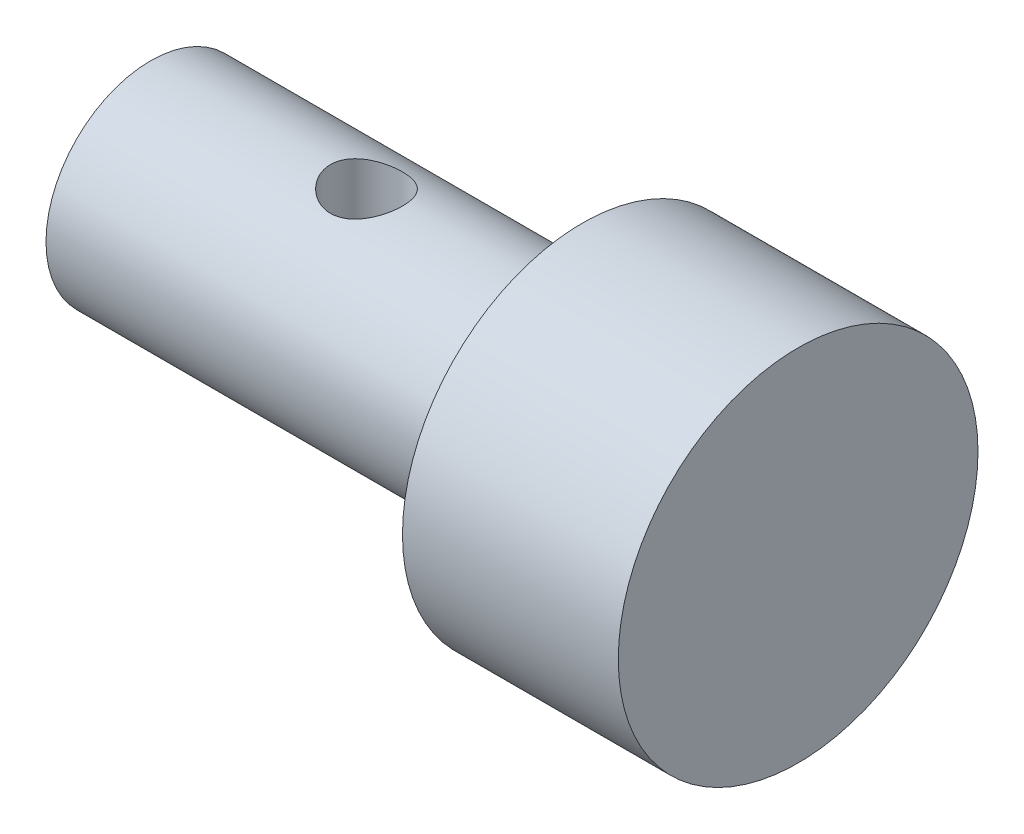
ISO-10303-21;
HEADER;
FILE_DESCRIPTION(('STEP AP214'),'2;1');
FILE_NAME('part.step','',(''),(''),'','','');
FILE_SCHEMA(('AUTOMOTIVE_DESIGN { 1 0 10303 214 1 1 1 1 }'));
ENDSEC;
DATA;
#1=APPLICATION_CONTEXT('core data for automotive mechanical design processes');
#2=APPLICATION_PROTOCOL_DEFINITION('international standard','automotive_design',2000,#1);
#3=PRODUCT_CONTEXT('',#1,'mechanical');
#4=PRODUCT('Part','Part','',(#3));
#5=PRODUCT_RELATED_PRODUCT_CATEGORY('part','',(#4));
#6=PRODUCT_DEFINITION_FORMATION('','',#4);
#7=PRODUCT_DEFINITION_CONTEXT('part definition',#1,'design');
#8=PRODUCT_DEFINITION('design','',#6,#7);
#9=PRODUCT_DEFINITION_SHAPE('','',#8);
#10=(LENGTH_UNIT() NAMED_UNIT(*) SI_UNIT(.MILLI.,.METRE.));
#11=(NAMED_UNIT(*) PLANE_ANGLE_UNIT() SI_UNIT($,.RADIAN.));
#12=(NAMED_UNIT(*) SI_UNIT($,.STERADIAN.) SOLID_ANGLE_UNIT());
#13=UNCERTAINTY_MEASURE_WITH_UNIT(LENGTH_MEASURE(1.E-05),#10,'distance_accuracy_value','');
#14=(GEOMETRIC_REPRESENTATION_CONTEXT(3) GLOBAL_UNCERTAINTY_ASSIGNED_CONTEXT((#13)) GLOBAL_UNIT_ASSIGNED_CONTEXT((#10,
#11,#12)) REPRESENTATION_CONTEXT('',''));
#15=CARTESIAN_POINT('',(0.,0.,0.));
#16=DIRECTION('',(0.,0.,1.));
#17=DIRECTION('',(1.,0.,0.));
#18=AXIS2_PLACEMENT_3D('',#15,#16,#17);
#19=CARTESIAN_POINT('',(6.,0.,0.));
#20=DIRECTION('',(-1.,0.,0.));
#21=DIRECTION('',(0.,0.,1.));
#22=AXIS2_PLACEMENT_3D('',#19,#20,#21);
#23=CYLINDRICAL_SURFACE('',#22,1.455);
#24=CARTESIAN_POINT('',(3.,-1.36639123240747,0.500000000000001));
#25=CARTESIAN_POINT('',(3.02717955991746,-1.36639097811817,0.500000312731613));
#26=CARTESIAN_POINT('',(3.05435695805042,-1.3672110489003,0.497776345713997));
#27=CARTESIAN_POINT('',(3.10790316012988,-1.37038431023373,0.488971673841802));
#28=CARTESIAN_POINT('',(3.13427187170271,-1.37273767525038,0.482390473199555));
#29=CARTESIAN_POINT('',(3.18541562417104,-1.37868015875037,0.465132564264616));
#30=CARTESIAN_POINT('',(3.21019382677888,-1.38226672943625,0.454464294689386));
#31=CARTESIAN_POINT('',(3.25761726235279,-1.39026770944465,0.42936418702639));
#32=CARTESIAN_POINT('',(3.28026197809996,-1.39468231873585,0.414931439499747));
#33=CARTESIAN_POINT('',(3.32371799419318,-1.40404795409862,0.382068692414853));
#34=CARTESIAN_POINT('',(3.34442764982769,-1.40901294814996,0.363508230347457));
#35=CARTESIAN_POINT('',(3.38251026359022,-1.41880223847988,0.323194958876108));
#36=CARTESIAN_POINT('',(3.39988264712127,-1.42362651040849,0.301441600868594));
#37=CARTESIAN_POINT('',(3.43126543844549,-1.43275353066899,0.25461005240966));
#38=CARTESIAN_POINT('',(3.44516840090946,-1.43703795070782,0.229455972061945));
#39=CARTESIAN_POINT('',(3.46850489200208,-1.44443717268994,0.176993427231699));
#40=CARTESIAN_POINT('',(3.47793970594978,-1.44755231093828,0.149685584945858));
#41=CARTESIAN_POINT('',(3.49172461408698,-1.45216299283854,0.0947571154949555));
#42=CARTESIAN_POINT('',(3.49624903833515,-1.45371391556177,0.0671849745644268));
#43=CARTESIAN_POINT('',(3.5006400547362,-1.45521851130384,0.0116321325668065));
#44=CARTESIAN_POINT('',(3.50050792121369,-1.45517262131027,-0.016348454628745));
#45=CARTESIAN_POINT('',(3.49569800888364,-1.45352574816606,-0.0706863211139652));
#46=CARTESIAN_POINT('',(3.49120979033516,-1.45198961593433,-0.0970626718601401));
#47=CARTESIAN_POINT('',(3.47812986112621,-1.44761714360993,-0.148662052440881));
#48=CARTESIAN_POINT('',(3.46953786826021,-1.44478071409985,-0.173885002828482));
#49=CARTESIAN_POINT('',(3.44838916471048,-1.43804602880742,-0.222864410317829));
#50=CARTESIAN_POINT('',(3.43578032109064,-1.43413390908427,-0.246596372051854));
#51=CARTESIAN_POINT('',(3.40699947712573,-1.42565240959854,-0.291662127171063));
#52=CARTESIAN_POINT('',(3.39082644364859,-1.42108283939799,-0.312995222496682));
#53=CARTESIAN_POINT('',(3.35443075951494,-1.41149683623094,-0.353783192591456));
#54=CARTESIAN_POINT('',(3.3340464503007,-1.40646948255308,-0.373091465112166));
#55=CARTESIAN_POINT('',(3.29028903101524,-1.39672419493074,-0.408064861632907));
#56=CARTESIAN_POINT('',(3.26691539920394,-1.39200631521816,-0.423729348317868));
#57=CARTESIAN_POINT('',(3.21735167832106,-1.38335212869181,-0.451190983426911));
#58=CARTESIAN_POINT('',(3.19112253336528,-1.37942952410187,-0.462922294548846));
#59=CARTESIAN_POINT('',(3.13689188192548,-1.37296824111035,-0.481750423449409));
#60=CARTESIAN_POINT('',(3.10889118086031,-1.37042893878043,-0.488849330926126));
#61=CARTESIAN_POINT('',(3.0533397472715,-1.36716435499601,-0.497904436508698));
#62=CARTESIAN_POINT('',(3.02583103246436,-1.36635848431615,-0.500089329754137));
#63=CARTESIAN_POINT('',(2.97083407681782,-1.36642601678656,-0.499905109547407));
#64=CARTESIAN_POINT('',(2.94334583301648,-1.3672990898199,-0.497536891336228));
#65=CARTESIAN_POINT('',(2.89024061650609,-1.37054542078883,-0.488519667509383));
#66=CARTESIAN_POINT('',(2.86459209045521,-1.37286149883476,-0.48203365376347));
#67=CARTESIAN_POINT('',(2.81475396729411,-1.37866879378836,-0.465162761685819));
#68=CARTESIAN_POINT('',(2.79056463982358,-1.38216022710582,-0.454777165311102));
#69=CARTESIAN_POINT('',(2.74344098095493,-1.39006814276105,-0.43001094582003));
#70=CARTESIAN_POINT('',(2.7205749644379,-1.39451148507407,-0.415509150754988));
#71=CARTESIAN_POINT('',(2.6775185702225,-1.40377216610918,-0.383057444619011));
#72=CARTESIAN_POINT('',(2.65732903173399,-1.40858962138712,-0.365106456354439));
#73=CARTESIAN_POINT('',(2.61912000582259,-1.4183566247392,-0.325165888852871));
#74=CARTESIAN_POINT('',(2.6012664465726,-1.42330014506522,-0.303015612372771));
#75=CARTESIAN_POINT('',(2.56951679607335,-1.43251855204168,-0.255911546870538));
#76=CARTESIAN_POINT('',(2.55562059249408,-1.43679345766928,-0.230957837452241));
#77=CARTESIAN_POINT('',(2.53230146191146,-1.44417620196691,-0.179059058741342));
#78=CARTESIAN_POINT('',(2.52285185253422,-1.44729097799921,-0.152127018589827));
#79=CARTESIAN_POINT('',(2.50865854653778,-1.45203172010686,-0.0969269784819325));
#80=CARTESIAN_POINT('',(2.50391303196139,-1.45365826131074,-0.068659499051247));
#81=CARTESIAN_POINT('',(2.49943421952671,-1.45519317203768,-0.0131041048340675));
#82=CARTESIAN_POINT('',(2.49946338210612,-1.45518296986363,0.0141626088901562));
#83=CARTESIAN_POINT('',(2.50394118325607,-1.45364883351676,0.068284584430689));
#84=CARTESIAN_POINT('',(2.50838942458913,-1.4521250354033,0.0951398830093806));
#85=CARTESIAN_POINT('',(2.5214188288416,-1.44776668608656,0.147199119922217));
#86=CARTESIAN_POINT('',(2.52992516835142,-1.44495590074719,0.172423918976896));
#87=CARTESIAN_POINT('',(2.55075893488614,-1.43831337530625,0.221096451645462));
#88=CARTESIAN_POINT('',(2.56308706598957,-1.43448144710052,0.244543856823398));
#89=CARTESIAN_POINT('',(2.59175726025526,-1.42600590188723,0.28997734186848));
#90=CARTESIAN_POINT('',(2.60823511547222,-1.42133679417001,0.311872906947894));
#91=CARTESIAN_POINT('',(2.64451022534527,-1.41176919148188,0.352664883251738));
#92=CARTESIAN_POINT('',(2.66430857221053,-1.40687062141728,0.371560303644531));
#93=CARTESIAN_POINT('',(2.70766343227637,-1.39714764987157,0.40663128516264));
#94=CARTESIAN_POINT('',(2.73134355274404,-1.39233516519014,0.422657858662002));
#95=CARTESIAN_POINT('',(2.78121235713878,-1.38357941215645,0.450496342588288));
#96=CARTESIAN_POINT('',(2.80740058408977,-1.37963598589265,0.462309018939636));
#97=CARTESIAN_POINT('',(2.86091235443471,-1.37320179115005,0.48108071708729));
#98=CARTESIAN_POINT('',(2.88819278447906,-1.37067801956557,0.488150816278888));
#99=CARTESIAN_POINT('',(2.94364982993206,-1.36727320579147,0.497609344327993));
#100=CARTESIAN_POINT('',(2.97182607639386,-1.36639149599994,0.499999675827108));
#101=CARTESIAN_POINT('',(3.,-1.36639123240747,0.500000000000001));
#102=B_SPLINE_CURVE_WITH_KNOTS('',3,(#24,#25,#26,#27,#28,#29,#30,#31,#32,#33,#34,#35,#36,#37,
#38,#39,#40,#41,#42,#43,#44,#45,#46,#47,#48,#49,#50,#51,#52,#53,#54,#55,#56,#57,#58,#59,#60,#61,
#62,#63,#64,#65,#66,#67,#68,#69,#70,#71,#72,#73,#74,#75,#76,#77,#78,#79,#80,#81,#82,#83,#84,#85,
#86,#87,#88,#89,#90,#91,#92,#93,#94,#95,#96,#97,#98,#99,#100,#101),.UNSPECIFIED.,.T.,.F.,(4,2,2,
2,2,2,2,2,2,2,2,2,2,2,2,2,2,2,2,2,2,2,2,2,2,2,2,2,2,2,2,2,2,2,2,2,2,2,4),(0.,0.0814342083502881,
0.162877684281834,0.244153899431236,0.325449767856164,0.409818297556403,0.494201340468621,
0.580941073467996,0.667655839514619,0.751179712047528,0.83468072741757,0.914703835375722,
0.994732447100178,1.07584520035367,1.1569814963114,1.24216162082256,1.32735663254974,
1.41391378507749,1.50043186424294,1.58283194249355,1.66521582074902,1.74452634377262,
1.82385147767105,1.90580983357864,1.98779382705759,2.07401200384483,2.16022773307441,
2.24591929981545,2.33157773703578,2.41297604003756,2.49436702668819,2.57431213634006,
2.65427198282888,2.73729800330363,2.82035138727783,2.90692039451618,2.99347365881173,
3.07792147702076,3.16233495435282),.UNSPECIFIED.);
#103=CARTESIAN_POINT('',(3.,-1.36639123240747,0.500000000000001));
#104=VERTEX_POINT('',#103);
#105=EDGE_CURVE('E41',#104,#104,#102,.T.);
#106=ORIENTED_EDGE('',*,*,#105,.T.);
#107=EDGE_LOOP('',(#106));
#108=FACE_BOUND('',#107,.T.);
#109=CARTESIAN_POINT('',(3.,1.36639123240747,0.500000000000001));
#110=CARTESIAN_POINT('',(2.97282044008254,1.36639097811817,0.500000312731613));
#111=CARTESIAN_POINT('',(2.94564304194958,1.3672110489003,0.497776345713997));
#112=CARTESIAN_POINT('',(2.89209683987012,1.37038431023373,0.488971673841802));
#113=CARTESIAN_POINT('',(2.86572812829729,1.37273767525038,0.482390473199555));
#114=CARTESIAN_POINT('',(2.81458437582896,1.37868015875037,0.465132564264616));
#115=CARTESIAN_POINT('',(2.78980617322112,1.38226672943625,0.454464294689386));
#116=CARTESIAN_POINT('',(2.74238273764721,1.39026770944465,0.42936418702639));
#117=CARTESIAN_POINT('',(2.71973802190004,1.39468231873585,0.414931439499747));
#118=CARTESIAN_POINT('',(2.67628200580682,1.40404795409862,0.382068692414853));
#119=CARTESIAN_POINT('',(2.65557235017231,1.40901294814996,0.363508230347457));
#120=CARTESIAN_POINT('',(2.61748973640978,1.41880223847988,0.323194958876108));
#121=CARTESIAN_POINT('',(2.60011735287873,1.42362651040849,0.301441600868594));
#122=CARTESIAN_POINT('',(2.56873456155451,1.43275353066899,0.25461005240966));
#123=CARTESIAN_POINT('',(2.55483159909054,1.43703795070782,0.229455972061945));
#124=CARTESIAN_POINT('',(2.53149510799792,1.44443717268994,0.176993427231699));
#125=CARTESIAN_POINT('',(2.52206029405022,1.44755231093828,0.149685584945858));
#126=CARTESIAN_POINT('',(2.50827538591302,1.45216299283854,0.0947571154949555));
#127=CARTESIAN_POINT('',(2.50375096166485,1.45371391556177,0.0671849745644268));
#128=CARTESIAN_POINT('',(2.4993599452638,1.45521851130384,0.0116321325668065));
#129=CARTESIAN_POINT('',(2.49949207878631,1.45517262131027,-0.016348454628745));
#130=CARTESIAN_POINT('',(2.50430199111636,1.45352574816606,-0.0706863211139652));
#131=CARTESIAN_POINT('',(2.50879020966484,1.45198961593433,-0.09706267186014));
#132=CARTESIAN_POINT('',(2.52187013887379,1.44761714360993,-0.148662052440881));
#133=CARTESIAN_POINT('',(2.53046213173979,1.44478071409985,-0.173885002828482));
#134=CARTESIAN_POINT('',(2.55161083528952,1.43804602880742,-0.222864410317829));
#135=CARTESIAN_POINT('',(2.56421967890936,1.43413390908427,-0.246596372051855));
#136=CARTESIAN_POINT('',(2.59300052287427,1.42565240959854,-0.291662127171063));
#137=CARTESIAN_POINT('',(2.60917355635141,1.42108283939799,-0.312995222496682));
#138=CARTESIAN_POINT('',(2.64556924048506,1.41149683623094,-0.353783192591456));
#139=CARTESIAN_POINT('',(2.6659535496993,1.40646948255308,-0.373091465112166));
#140=CARTESIAN_POINT('',(2.70971096898476,1.39672419493074,-0.408064861632907));
#141=CARTESIAN_POINT('',(2.73308460079606,1.39200631521816,-0.423729348317868));
#142=CARTESIAN_POINT('',(2.78264832167894,1.38335212869181,-0.451190983426911));
#143=CARTESIAN_POINT('',(2.80887746663472,1.37942952410187,-0.462922294548846));
#144=CARTESIAN_POINT('',(2.86310811807453,1.37296824111035,-0.481750423449409));
#145=CARTESIAN_POINT('',(2.89110881913969,1.37042893878043,-0.488849330926126));
#146=CARTESIAN_POINT('',(2.9466602527285,1.36716435499601,-0.497904436508698));
#147=CARTESIAN_POINT('',(2.97416896753564,1.36635848431615,-0.500089329754137));
#148=CARTESIAN_POINT('',(3.02916592318218,1.36642601678656,-0.499905109547407));
#149=CARTESIAN_POINT('',(3.05665416698352,1.3672990898199,-0.497536891336228));
#150=CARTESIAN_POINT('',(3.10975938349391,1.37054542078883,-0.488519667509383));
#151=CARTESIAN_POINT('',(3.13540790954479,1.37286149883476,-0.48203365376347));
#152=CARTESIAN_POINT('',(3.18524603270589,1.37866879378836,-0.465162761685819));
#153=CARTESIAN_POINT('',(3.20943536017642,1.38216022710582,-0.454777165311102));
#154=CARTESIAN_POINT('',(3.25655901904507,1.39006814276105,-0.43001094582003));
#155=CARTESIAN_POINT('',(3.2794250355621,1.39451148507407,-0.415509150754988));
#156=CARTESIAN_POINT('',(3.32248142977751,1.40377216610918,-0.383057444619011));
#157=CARTESIAN_POINT('',(3.34267096826601,1.40858962138712,-0.365106456354439));
#158=CARTESIAN_POINT('',(3.38087999417741,1.4183566247392,-0.325165888852871));
#159=CARTESIAN_POINT('',(3.3987335534274,1.42330014506522,-0.303015612372771));
#160=CARTESIAN_POINT('',(3.43048320392665,1.43251855204168,-0.255911546870538));
#161=CARTESIAN_POINT('',(3.44437940750592,1.43679345766928,-0.230957837452241));
#162=CARTESIAN_POINT('',(3.46769853808854,1.44417620196691,-0.179059058741342));
#163=CARTESIAN_POINT('',(3.47714814746578,1.44729097799921,-0.152127018589827));
#164=CARTESIAN_POINT('',(3.49134145346222,1.45203172010686,-0.0969269784819325));
#165=CARTESIAN_POINT('',(3.49608696803861,1.45365826131074,-0.0686594990512471));
#166=CARTESIAN_POINT('',(3.50056578047329,1.45519317203768,-0.0131041048340675));
#167=CARTESIAN_POINT('',(3.50053661789388,1.45518296986363,0.0141626088901563));
#168=CARTESIAN_POINT('',(3.49605881674393,1.45364883351676,0.068284584430689));
#169=CARTESIAN_POINT('',(3.49161057541087,1.4521250354033,0.0951398830093806));
#170=CARTESIAN_POINT('',(3.4785811711584,1.44776668608656,0.147199119922217));
#171=CARTESIAN_POINT('',(3.47007483164858,1.44495590074719,0.172423918976896));
#172=CARTESIAN_POINT('',(3.44924106511386,1.43831337530625,0.221096451645462));
#173=CARTESIAN_POINT('',(3.43691293401043,1.43448144710052,0.244543856823398));
#174=CARTESIAN_POINT('',(3.40824273974474,1.42600590188723,0.28997734186848));
#175=CARTESIAN_POINT('',(3.39176488452778,1.42133679417001,0.311872906947895));
#176=CARTESIAN_POINT('',(3.35548977465473,1.41176919148188,0.352664883251738));
#177=CARTESIAN_POINT('',(3.33569142778947,1.40687062141728,0.371560303644531));
#178=CARTESIAN_POINT('',(3.29233656772363,1.39714764987157,0.40663128516264));
#179=CARTESIAN_POINT('',(3.26865644725596,1.39233516519014,0.422657858662001));
#180=CARTESIAN_POINT('',(3.21878764286122,1.38357941215645,0.450496342588288));
#181=CARTESIAN_POINT('',(3.19259941591023,1.37963598589265,0.462309018939636));
#182=CARTESIAN_POINT('',(3.13908764556529,1.37320179115005,0.48108071708729));
#183=CARTESIAN_POINT('',(3.11180721552094,1.37067801956557,0.488150816278888));
#184=CARTESIAN_POINT('',(3.05635017006794,1.36727320579147,0.497609344327993));
#185=CARTESIAN_POINT('',(3.02817392360614,1.36639149599994,0.499999675827108));
#186=CARTESIAN_POINT('',(3.,1.36639123240747,0.500000000000001));
#187=B_SPLINE_CURVE_WITH_KNOTS('',3,(#109,#110,#111,#112,#113,#114,#115,#116,#117,#118,#119,
#120,#121,#122,#123,#124,#125,#126,#127,#128,#129,#130,#131,#132,#133,#134,#135,#136,#137,#138,
#139,#140,#141,#142,#143,#144,#145,#146,#147,#148,#149,#150,#151,#152,#153,#154,#155,#156,#157,
#158,#159,#160,#161,#162,#163,#164,#165,#166,#167,#168,#169,#170,#171,#172,#173,#174,#175,#176,
#177,#178,#179,#180,#181,#182,#183,#184,#185,#186),.UNSPECIFIED.,.T.,.F.,(4,2,2,2,2,2,2,2,2,2,2,
2,2,2,2,2,2,2,2,2,2,2,2,2,2,2,2,2,2,2,2,2,2,2,2,2,2,2,4),(0.,0.0814342083502881,
0.162877684281834,0.244153899431236,0.325449767856164,0.409818297556403,0.494201340468621,
0.580941073467996,0.667655839514619,0.751179712047528,0.83468072741757,0.914703835375722,
0.994732447100178,1.07584520035367,1.1569814963114,1.24216162082256,1.32735663254974,
1.41391378507749,1.50043186424294,1.58283194249355,1.66521582074902,1.74452634377262,
1.82385147767105,1.90580983357864,1.98779382705759,2.07401200384483,2.16022773307441,
2.24591929981545,2.33157773703578,2.41297604003756,2.49436702668819,2.57431213634006,
2.65427198282888,2.73729800330363,2.82035138727782,2.90692039451618,2.99347365881173,
3.07792147702076,3.16233495435282),.UNSPECIFIED.);
#188=CARTESIAN_POINT('',(3.,1.36639123240747,0.500000000000001));
#189=VERTEX_POINT('',#188);
#190=EDGE_CURVE('E59',#189,#189,#187,.T.);
#191=ORIENTED_EDGE('',*,*,#190,.T.);
#192=EDGE_LOOP('',(#191));
#193=FACE_BOUND('',#192,.T.);
#194=CARTESIAN_POINT('',(6.,0.,0.));
#195=DIRECTION('',(1.,0.,0.));
#196=DIRECTION('',(0.,0.,-1.));
#197=AXIS2_PLACEMENT_3D('',#194,#195,#196);
#198=CIRCLE('',#197,1.455);
#199=CARTESIAN_POINT('',(6.,0.,-1.455));
#200=VERTEX_POINT('',#199);
#201=EDGE_CURVE('E10',#200,#200,#198,.T.);
#202=ORIENTED_EDGE('',*,*,#201,.F.);
#203=EDGE_LOOP('',(#202));
#204=FACE_BOUND('',#203,.T.);
#205=CARTESIAN_POINT('',(0.,0.,0.));
#206=DIRECTION('',(1.,0.,0.));
#207=DIRECTION('',(0.,0.,-1.));
#208=AXIS2_PLACEMENT_3D('',#205,#206,#207);
#209=CIRCLE('',#208,1.455);
#210=CARTESIAN_POINT('',(0.,0.,-1.455));
#211=VERTEX_POINT('',#210);
#212=EDGE_CURVE('E49',#211,#211,#209,.T.);
#213=ORIENTED_EDGE('',*,*,#212,.T.);
#214=EDGE_LOOP('',(#213));
#215=FACE_BOUND('',#214,.T.);
#216=ADVANCED_FACE('F37',(#108,#193,#204,#215),#23,.T.);
#217=CARTESIAN_POINT('',(0.,0.,0.));
#218=DIRECTION('',(1.,0.,0.));
#219=DIRECTION('',(0.,0.,-1.));
#220=AXIS2_PLACEMENT_3D('',#217,#218,#219);
#221=PLANE('',#220);
#222=ORIENTED_EDGE('',*,*,#212,.F.);
#223=EDGE_LOOP('',(#222));
#224=FACE_BOUND('',#223,.T.);
#225=ADVANCED_FACE('F79',(#224),#221,.F.);
#226=CARTESIAN_POINT('',(9.,0.,0.));
#227=DIRECTION('',(-1.,0.,0.));
#228=DIRECTION('',(0.,0.,1.));
#229=AXIS2_PLACEMENT_3D('',#226,#227,#228);
#230=CYLINDRICAL_SURFACE('',#229,2.5);
#231=CARTESIAN_POINT('',(9.,0.,0.));
#232=DIRECTION('',(1.,0.,0.));
#233=DIRECTION('',(0.,0.,-1.));
#234=AXIS2_PLACEMENT_3D('',#231,#232,#233);
#235=CIRCLE('',#234,2.5);
#236=CARTESIAN_POINT('',(9.,0.,-2.5));
#237=VERTEX_POINT('',#236);
#238=EDGE_CURVE('E54',#237,#237,#235,.T.);
#239=ORIENTED_EDGE('',*,*,#238,.F.);
#240=EDGE_LOOP('',(#239));
#241=FACE_BOUND('',#240,.T.);
#242=CARTESIAN_POINT('',(6.,0.,0.));
#243=DIRECTION('',(1.,0.,0.));
#244=DIRECTION('',(0.,0.,-1.));
#245=AXIS2_PLACEMENT_3D('',#242,#243,#244);
#246=CIRCLE('',#245,2.5);
#247=CARTESIAN_POINT('',(6.,0.,-2.5));
#248=VERTEX_POINT('',#247);
#249=EDGE_CURVE('E57',#248,#248,#246,.T.);
#250=ORIENTED_EDGE('',*,*,#249,.T.);
#251=EDGE_LOOP('',(#250));
#252=FACE_BOUND('',#251,.T.);
#253=ADVANCED_FACE('F74',(#241,#252),#230,.T.);
#254=CARTESIAN_POINT('',(9.,0.,0.));
#255=DIRECTION('',(1.,0.,0.));
#256=DIRECTION('',(0.,0.,-1.));
#257=AXIS2_PLACEMENT_3D('',#254,#255,#256);
#258=PLANE('',#257);
#259=ORIENTED_EDGE('',*,*,#238,.T.);
#260=EDGE_LOOP('',(#259));
#261=FACE_BOUND('',#260,.T.);
#262=ADVANCED_FACE('F70',(#261),#258,.T.);
#263=CARTESIAN_POINT('',(6.,0.,0.));
#264=DIRECTION('',(1.,0.,0.));
#265=DIRECTION('',(0.,0.,-1.));
#266=AXIS2_PLACEMENT_3D('',#263,#264,#265);
#267=PLANE('',#266);
#268=ORIENTED_EDGE('',*,*,#201,.T.);
#269=EDGE_LOOP('',(#268));
#270=FACE_BOUND('',#269,.T.);
#271=ORIENTED_EDGE('',*,*,#249,.F.);
#272=EDGE_LOOP('',(#271));
#273=FACE_BOUND('',#272,.T.);
#274=ADVANCED_FACE('F68',(#270,#273),#267,.F.);
#275=CARTESIAN_POINT('',(3.,-2.5,0.));
#276=DIRECTION('',(0.,1.,0.));
#277=DIRECTION('',(0.,0.,1.));
#278=AXIS2_PLACEMENT_3D('',#275,#276,#277);
#279=CYLINDRICAL_SURFACE('',#278,0.500000000000001);
#280=ORIENTED_EDGE('',*,*,#190,.F.);
#281=EDGE_LOOP('',(#280));
#282=FACE_BOUND('',#281,.T.);
#283=ORIENTED_EDGE('',*,*,#105,.F.);
#284=EDGE_LOOP('',(#283));
#285=FACE_BOUND('',#284,.T.);
#286=ADVANCED_FACE('F64',(#282,#285),#279,.F.);
#287=CLOSED_SHELL('',(#216,#225,#253,#262,#274,#286));
#288=MANIFOLD_SOLID_BREP('B2',#287);
#289=ADVANCED_BREP_SHAPE_REPRESENTATION('',(#18,#288),#14);
#290=SHAPE_DEFINITION_REPRESENTATION(#9,#289);
ENDSEC;
END-ISO-10303-21;
